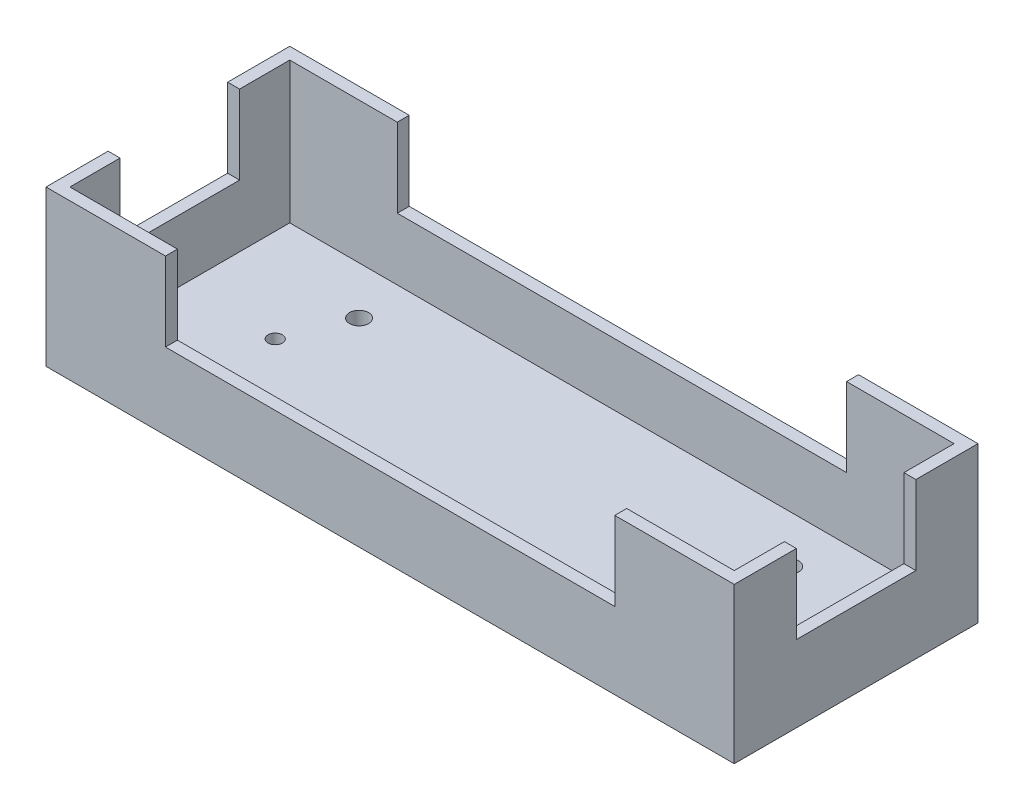
ISO-10303-21;
HEADER;
FILE_DESCRIPTION(('STEP AP214'),'2;1');
FILE_NAME('part.step','',(''),(''),'','','');
FILE_SCHEMA(('AUTOMOTIVE_DESIGN { 1 0 10303 214 1 1 1 1 }'));
ENDSEC;
DATA;
#1=APPLICATION_CONTEXT('core data for automotive mechanical design processes');
#2=APPLICATION_PROTOCOL_DEFINITION('international standard','automotive_design',2000,#1);
#3=PRODUCT_CONTEXT('',#1,'mechanical');
#4=PRODUCT('Part','Part','',(#3));
#5=PRODUCT_RELATED_PRODUCT_CATEGORY('part','',(#4));
#6=PRODUCT_DEFINITION_FORMATION('','',#4);
#7=PRODUCT_DEFINITION_CONTEXT('part definition',#1,'design');
#8=PRODUCT_DEFINITION('design','',#6,#7);
#9=PRODUCT_DEFINITION_SHAPE('','',#8);
#10=(LENGTH_UNIT() NAMED_UNIT(*) SI_UNIT(.MILLI.,.METRE.));
#11=(NAMED_UNIT(*) PLANE_ANGLE_UNIT() SI_UNIT($,.RADIAN.));
#12=(NAMED_UNIT(*) SI_UNIT($,.STERADIAN.) SOLID_ANGLE_UNIT());
#13=UNCERTAINTY_MEASURE_WITH_UNIT(LENGTH_MEASURE(1.E-05),#10,'distance_accuracy_value','');
#14=(GEOMETRIC_REPRESENTATION_CONTEXT(3) GLOBAL_UNCERTAINTY_ASSIGNED_CONTEXT((#13)) GLOBAL_UNIT_ASSIGNED_CONTEXT((#10,
#11,#12)) REPRESENTATION_CONTEXT('',''));
#15=CARTESIAN_POINT('',(0.,0.,0.));
#16=DIRECTION('',(0.,0.,1.));
#17=DIRECTION('',(1.,0.,0.));
#18=AXIS2_PLACEMENT_3D('',#15,#16,#17);
#19=CARTESIAN_POINT('',(0.,16.,0.));
#20=DIRECTION('',(0.,-1.,0.));
#21=DIRECTION('',(0.,0.,-1.));
#22=AXIS2_PLACEMENT_3D('',#19,#20,#21);
#23=PLANE('',#22);
#24=DIRECTION('',(0.,0.,-1.));
#25=VECTOR('',#24,1.);
#26=CARTESIAN_POINT('',(-47.,16.,23.));
#27=LINE('',#26,#25);
#28=CARTESIAN_POINT('',(-47.,16.,25.5));
#29=VERTEX_POINT('',#28);
#30=CARTESIAN_POINT('',(-47.,16.,23.));
#31=VERTEX_POINT('',#30);
#32=EDGE_CURVE('E58',#29,#31,#27,.T.);
#33=ORIENTED_EDGE('',*,*,#32,.F.);
#34=DIRECTION('',(-1.,0.,0.));
#35=VECTOR('',#34,1.);
#36=CARTESIAN_POINT('',(0.,16.,25.5));
#37=LINE('',#36,#35);
#38=CARTESIAN_POINT('',(47.,16.,25.5));
#39=VERTEX_POINT('',#38);
#40=EDGE_CURVE('E391',#39,#29,#37,.T.);
#41=ORIENTED_EDGE('',*,*,#40,.F.);
#42=DIRECTION('',(0.,0.,1.));
#43=VECTOR('',#42,1.);
#44=CARTESIAN_POINT('',(47.,16.,23.));
#45=LINE('',#44,#43);
#46=CARTESIAN_POINT('',(47.,16.,23.));
#47=VERTEX_POINT('',#46);
#48=EDGE_CURVE('E227',#47,#39,#45,.T.);
#49=ORIENTED_EDGE('',*,*,#48,.F.);
#50=DIRECTION('',(-1.,0.,0.));
#51=VECTOR('',#50,1.);
#52=CARTESIAN_POINT('',(0.,16.,23.));
#53=LINE('',#52,#51);
#54=EDGE_CURVE('E332',#47,#31,#53,.T.);
#55=ORIENTED_EDGE('',*,*,#54,.T.);
#56=EDGE_LOOP('',(#33,#41,#49,#55));
#57=FACE_BOUND('',#56,.T.);
#58=ADVANCED_FACE('F33',(#57),#23,.F.);
#59=DIRECTION('',(-1.,0.,0.));
#60=VECTOR('',#59,1.);
#61=CARTESIAN_POINT('',(-72.,16.,12.5));
#62=LINE('',#61,#60);
#63=CARTESIAN_POINT('',(-69.5,16.,12.5));
#64=VERTEX_POINT('',#63);
#65=CARTESIAN_POINT('',(-72.,16.,12.5));
#66=VERTEX_POINT('',#65);
#67=EDGE_CURVE('E220',#64,#66,#62,.T.);
#68=ORIENTED_EDGE('',*,*,#67,.F.);
#69=DIRECTION('',(0.,0.,-1.));
#70=VECTOR('',#69,1.);
#71=CARTESIAN_POINT('',(-69.5,16.,0.));
#72=LINE('',#71,#70);
#73=CARTESIAN_POINT('',(-69.5,16.,-12.5));
#74=VERTEX_POINT('',#73);
#75=EDGE_CURVE('E345',#64,#74,#72,.T.);
#76=ORIENTED_EDGE('',*,*,#75,.T.);
#77=DIRECTION('',(1.,0.,0.));
#78=VECTOR('',#77,1.);
#79=CARTESIAN_POINT('',(-72.,16.,-12.5));
#80=LINE('',#79,#78);
#81=CARTESIAN_POINT('',(-72.,16.,-12.5));
#82=VERTEX_POINT('',#81);
#83=EDGE_CURVE('E295',#82,#74,#80,.T.);
#84=ORIENTED_EDGE('',*,*,#83,.F.);
#85=DIRECTION('',(0.,0.,-1.));
#86=VECTOR('',#85,1.);
#87=CARTESIAN_POINT('',(-72.,16.,0.));
#88=LINE('',#87,#86);
#89=EDGE_CURVE('E50',#66,#82,#88,.T.);
#90=ORIENTED_EDGE('',*,*,#89,.F.);
#91=EDGE_LOOP('',(#68,#76,#84,#90));
#92=FACE_BOUND('',#91,.T.);
#93=ADVANCED_FACE('F453',(#92),#23,.F.);
#94=DIRECTION('',(-1.,0.,0.));
#95=VECTOR('',#94,1.);
#96=CARTESIAN_POINT('',(72.,16.,12.5));
#97=LINE('',#96,#95);
#98=CARTESIAN_POINT('',(72.,16.,12.5));
#99=VERTEX_POINT('',#98);
#100=CARTESIAN_POINT('',(69.5,16.,12.5));
#101=VERTEX_POINT('',#100);
#102=EDGE_CURVE('E223',#99,#101,#97,.T.);
#103=ORIENTED_EDGE('',*,*,#102,.F.);
#104=DIRECTION('',(0.,0.,1.));
#105=VECTOR('',#104,1.);
#106=CARTESIAN_POINT('',(72.,16.,0.));
#107=LINE('',#106,#105);
#108=CARTESIAN_POINT('',(72.,16.,-12.5));
#109=VERTEX_POINT('',#108);
#110=EDGE_CURVE('E386',#109,#99,#107,.T.);
#111=ORIENTED_EDGE('',*,*,#110,.F.);
#112=DIRECTION('',(1.,0.,0.));
#113=VECTOR('',#112,1.);
#114=CARTESIAN_POINT('',(72.,16.,-12.5));
#115=LINE('',#114,#113);
#116=CARTESIAN_POINT('',(69.5,16.,-12.5));
#117=VERTEX_POINT('',#116);
#118=EDGE_CURVE('E267',#117,#109,#115,.T.);
#119=ORIENTED_EDGE('',*,*,#118,.F.);
#120=DIRECTION('',(0.,0.,1.));
#121=VECTOR('',#120,1.);
#122=CARTESIAN_POINT('',(69.5,16.,0.));
#123=LINE('',#122,#121);
#124=EDGE_CURVE('E355',#117,#101,#123,.T.);
#125=ORIENTED_EDGE('',*,*,#124,.T.);
#126=EDGE_LOOP('',(#103,#111,#119,#125));
#127=FACE_BOUND('',#126,.T.);
#128=ADVANCED_FACE('F485',(#127),#23,.F.);
#129=DIRECTION('',(0.,0.,1.));
#130=VECTOR('',#129,1.);
#131=CARTESIAN_POINT('',(47.,16.,-23.));
#132=LINE('',#131,#130);
#133=CARTESIAN_POINT('',(47.,16.,-25.5));
#134=VERTEX_POINT('',#133);
#135=CARTESIAN_POINT('',(47.,16.,-23.));
#136=VERTEX_POINT('',#135);
#137=EDGE_CURVE('E262',#134,#136,#132,.T.);
#138=ORIENTED_EDGE('',*,*,#137,.F.);
#139=DIRECTION('',(1.,0.,0.));
#140=VECTOR('',#139,1.);
#141=CARTESIAN_POINT('',(0.,16.,-25.5));
#142=LINE('',#141,#140);
#143=CARTESIAN_POINT('',(-47.,16.,-25.5));
#144=VERTEX_POINT('',#143);
#145=EDGE_CURVE('E320',#144,#134,#142,.T.);
#146=ORIENTED_EDGE('',*,*,#145,.F.);
#147=DIRECTION('',(0.,0.,-1.));
#148=VECTOR('',#147,1.);
#149=CARTESIAN_POINT('',(-47.,16.,-23.));
#150=LINE('',#149,#148);
#151=CARTESIAN_POINT('',(-47.,16.,-23.));
#152=VERTEX_POINT('',#151);
#153=EDGE_CURVE('E300',#152,#144,#150,.T.);
#154=ORIENTED_EDGE('',*,*,#153,.F.);
#155=DIRECTION('',(1.,0.,0.));
#156=VECTOR('',#155,1.);
#157=CARTESIAN_POINT('',(0.,16.,-23.));
#158=LINE('',#157,#156);
#159=EDGE_CURVE('E348',#152,#136,#158,.T.);
#160=ORIENTED_EDGE('',*,*,#159,.T.);
#161=EDGE_LOOP('',(#138,#146,#154,#160));
#162=FACE_BOUND('',#161,.T.);
#163=ADVANCED_FACE('F487',(#162),#23,.F.);
#164=CARTESIAN_POINT('',(-72.,3.,-25.5));
#165=DIRECTION('',(1.,0.,0.));
#166=DIRECTION('',(0.,0.,-1.));
#167=AXIS2_PLACEMENT_3D('',#164,#165,#166);
#168=PLANE('',#167);
#169=DIRECTION('',(0.,0.,1.));
#170=VECTOR('',#169,1.);
#171=CARTESIAN_POINT('',(-72.,0.,-25.5));
#172=LINE('',#171,#170);
#173=CARTESIAN_POINT('',(-72.,0.,-25.5));
#174=VERTEX_POINT('',#173);
#175=CARTESIAN_POINT('',(-72.,0.,25.5));
#176=VERTEX_POINT('',#175);
#177=EDGE_CURVE('E372',#174,#176,#172,.T.);
#178=ORIENTED_EDGE('',*,*,#177,.T.);
#179=DIRECTION('',(0.,-1.,0.));
#180=VECTOR('',#179,1.);
#181=CARTESIAN_POINT('',(-72.,3.,25.5));
#182=LINE('',#181,#180);
#183=CARTESIAN_POINT('',(-72.,32.5,25.5));
#184=VERTEX_POINT('',#183);
#185=EDGE_CURVE('E11',#184,#176,#182,.T.);
#186=ORIENTED_EDGE('',*,*,#185,.F.);
#187=DIRECTION('',(0.,0.,1.));
#188=VECTOR('',#187,1.);
#189=CARTESIAN_POINT('',(-72.,32.5,25.5));
#190=LINE('',#189,#188);
#191=CARTESIAN_POINT('',(-72.,32.5,12.5));
#192=VERTEX_POINT('',#191);
#193=EDGE_CURVE('E437',#192,#184,#190,.T.);
#194=ORIENTED_EDGE('',*,*,#193,.F.);
#195=DIRECTION('',(0.,-1.,0.));
#196=VECTOR('',#195,1.);
#197=CARTESIAN_POINT('',(-72.,32.5,12.5));
#198=LINE('',#197,#196);
#199=EDGE_CURVE('E230',#192,#66,#198,.T.);
#200=ORIENTED_EDGE('',*,*,#199,.T.);
#201=ORIENTED_EDGE('',*,*,#89,.T.);
#202=DIRECTION('',(0.,-1.,0.));
#203=VECTOR('',#202,1.);
#204=CARTESIAN_POINT('',(-72.,32.5,-12.5));
#205=LINE('',#204,#203);
#206=CARTESIAN_POINT('',(-72.,32.5,-12.5));
#207=VERTEX_POINT('',#206);
#208=EDGE_CURVE('E326',#207,#82,#205,.T.);
#209=ORIENTED_EDGE('',*,*,#208,.F.);
#210=DIRECTION('',(0.,0.,1.));
#211=VECTOR('',#210,1.);
#212=CARTESIAN_POINT('',(-72.,32.5,-25.5));
#213=LINE('',#212,#211);
#214=CARTESIAN_POINT('',(-72.,32.5,-25.5));
#215=VERTEX_POINT('',#214);
#216=EDGE_CURVE('E299',#215,#207,#213,.T.);
#217=ORIENTED_EDGE('',*,*,#216,.F.);
#218=DIRECTION('',(0.,-1.,0.));
#219=VECTOR('',#218,1.);
#220=CARTESIAN_POINT('',(-72.,3.,-25.5));
#221=LINE('',#220,#219);
#222=EDGE_CURVE('E363',#215,#174,#221,.T.);
#223=ORIENTED_EDGE('',*,*,#222,.T.);
#224=EDGE_LOOP('',(#178,#186,#194,#200,#201,#209,#217,#223));
#225=FACE_BOUND('',#224,.T.);
#226=ADVANCED_FACE('F35',(#225),#168,.F.);
#227=CARTESIAN_POINT('',(72.,3.,25.5));
#228=DIRECTION('',(0.,0.,-1.));
#229=DIRECTION('',(-1.,0.,0.));
#230=AXIS2_PLACEMENT_3D('',#227,#228,#229);
#231=PLANE('',#230);
#232=DIRECTION('',(1.,0.,0.));
#233=VECTOR('',#232,1.);
#234=CARTESIAN_POINT('',(72.,0.,25.5));
#235=LINE('',#234,#233);
#236=CARTESIAN_POINT('',(72.,0.,25.5));
#237=VERTEX_POINT('',#236);
#238=EDGE_CURVE('E370',#176,#237,#235,.T.);
#239=ORIENTED_EDGE('',*,*,#238,.T.);
#240=DIRECTION('',(0.,-1.,0.));
#241=VECTOR('',#240,1.);
#242=CARTESIAN_POINT('',(72.,3.,25.5));
#243=LINE('',#242,#241);
#244=CARTESIAN_POINT('',(72.,32.5,25.5));
#245=VERTEX_POINT('',#244);
#246=EDGE_CURVE('E42',#245,#237,#243,.T.);
#247=ORIENTED_EDGE('',*,*,#246,.F.);
#248=DIRECTION('',(1.,0.,0.));
#249=VECTOR('',#248,1.);
#250=CARTESIAN_POINT('',(47.,32.5,25.5));
#251=LINE('',#250,#249);
#252=CARTESIAN_POINT('',(47.,32.5,25.5));
#253=VERTEX_POINT('',#252);
#254=EDGE_CURVE('E234',#253,#245,#251,.T.);
#255=ORIENTED_EDGE('',*,*,#254,.F.);
#256=DIRECTION('',(0.,-1.,0.));
#257=VECTOR('',#256,1.);
#258=CARTESIAN_POINT('',(47.,32.5,25.5));
#259=LINE('',#258,#257);
#260=EDGE_CURVE('E247',#253,#39,#259,.T.);
#261=ORIENTED_EDGE('',*,*,#260,.T.);
#262=ORIENTED_EDGE('',*,*,#40,.T.);
#263=DIRECTION('',(0.,-1.,0.));
#264=VECTOR('',#263,1.);
#265=CARTESIAN_POINT('',(-47.,32.5,25.5));
#266=LINE('',#265,#264);
#267=CARTESIAN_POINT('',(-47.,32.5,25.5));
#268=VERTEX_POINT('',#267);
#269=EDGE_CURVE('E442',#268,#29,#266,.T.);
#270=ORIENTED_EDGE('',*,*,#269,.F.);
#271=DIRECTION('',(1.,0.,0.));
#272=VECTOR('',#271,1.);
#273=CARTESIAN_POINT('',(-47.,32.5,25.5));
#274=LINE('',#273,#272);
#275=EDGE_CURVE('E216',#184,#268,#274,.T.);
#276=ORIENTED_EDGE('',*,*,#275,.F.);
#277=ORIENTED_EDGE('',*,*,#185,.T.);
#278=EDGE_LOOP('',(#239,#247,#255,#261,#262,#270,#276,#277));
#279=FACE_BOUND('',#278,.T.);
#280=ADVANCED_FACE('F477',(#279),#231,.F.);
#281=CARTESIAN_POINT('',(72.,3.,-25.5));
#282=DIRECTION('',(-1.,0.,0.));
#283=DIRECTION('',(0.,0.,1.));
#284=AXIS2_PLACEMENT_3D('',#281,#282,#283);
#285=PLANE('',#284);
#286=DIRECTION('',(0.,0.,-1.));
#287=VECTOR('',#286,1.);
#288=CARTESIAN_POINT('',(72.,0.,-25.5));
#289=LINE('',#288,#287);
#290=CARTESIAN_POINT('',(72.,0.,-25.5));
#291=VERTEX_POINT('',#290);
#292=EDGE_CURVE('E368',#237,#291,#289,.T.);
#293=ORIENTED_EDGE('',*,*,#292,.T.);
#294=DIRECTION('',(0.,-1.,0.));
#295=VECTOR('',#294,1.);
#296=CARTESIAN_POINT('',(72.,3.,-25.5));
#297=LINE('',#296,#295);
#298=CARTESIAN_POINT('',(72.,32.5,-25.5));
#299=VERTEX_POINT('',#298);
#300=EDGE_CURVE('E360',#299,#291,#297,.T.);
#301=ORIENTED_EDGE('',*,*,#300,.F.);
#302=DIRECTION('',(0.,0.,-1.));
#303=VECTOR('',#302,1.);
#304=CARTESIAN_POINT('',(72.,32.5,-25.5));
#305=LINE('',#304,#303);
#306=CARTESIAN_POINT('',(72.,32.5,-12.5));
#307=VERTEX_POINT('',#306);
#308=EDGE_CURVE('E274',#307,#299,#305,.T.);
#309=ORIENTED_EDGE('',*,*,#308,.F.);
#310=DIRECTION('',(0.,-1.,0.));
#311=VECTOR('',#310,1.);
#312=CARTESIAN_POINT('',(72.,32.5,-12.5));
#313=LINE('',#312,#311);
#314=EDGE_CURVE('E286',#307,#109,#313,.T.);
#315=ORIENTED_EDGE('',*,*,#314,.T.);
#316=ORIENTED_EDGE('',*,*,#110,.T.);
#317=DIRECTION('',(0.,-1.,0.));
#318=VECTOR('',#317,1.);
#319=CARTESIAN_POINT('',(72.,32.5,12.5));
#320=LINE('',#319,#318);
#321=CARTESIAN_POINT('',(72.,32.5,12.5));
#322=VERTEX_POINT('',#321);
#323=EDGE_CURVE('E259',#322,#99,#320,.T.);
#324=ORIENTED_EDGE('',*,*,#323,.F.);
#325=DIRECTION('',(0.,0.,-1.));
#326=VECTOR('',#325,1.);
#327=CARTESIAN_POINT('',(72.,32.5,25.5));
#328=LINE('',#327,#326);
#329=EDGE_CURVE('E237',#245,#322,#328,.T.);
#330=ORIENTED_EDGE('',*,*,#329,.F.);
#331=ORIENTED_EDGE('',*,*,#246,.T.);
#332=EDGE_LOOP('',(#293,#301,#309,#315,#316,#324,#330,#331));
#333=FACE_BOUND('',#332,.T.);
#334=ADVANCED_FACE('F484',(#333),#285,.F.);
#335=CARTESIAN_POINT('',(72.,3.,-25.5));
#336=DIRECTION('',(0.,0.,1.));
#337=DIRECTION('',(1.,0.,0.));
#338=AXIS2_PLACEMENT_3D('',#335,#336,#337);
#339=PLANE('',#338);
#340=DIRECTION('',(-1.,0.,0.));
#341=VECTOR('',#340,1.);
#342=CARTESIAN_POINT('',(72.,0.,-25.5));
#343=LINE('',#342,#341);
#344=EDGE_CURVE('E366',#291,#174,#343,.T.);
#345=ORIENTED_EDGE('',*,*,#344,.T.);
#346=ORIENTED_EDGE('',*,*,#222,.F.);
#347=DIRECTION('',(-1.,0.,0.));
#348=VECTOR('',#347,1.);
#349=CARTESIAN_POINT('',(-47.,32.5,-25.5));
#350=LINE('',#349,#348);
#351=CARTESIAN_POINT('',(-47.,32.5,-25.5));
#352=VERTEX_POINT('',#351);
#353=EDGE_CURVE('E296',#352,#215,#350,.T.);
#354=ORIENTED_EDGE('',*,*,#353,.F.);
#355=DIRECTION('',(0.,-1.,0.));
#356=VECTOR('',#355,1.);
#357=CARTESIAN_POINT('',(-47.,32.5,-25.5));
#358=LINE('',#357,#356);
#359=EDGE_CURVE('E311',#352,#144,#358,.T.);
#360=ORIENTED_EDGE('',*,*,#359,.T.);
#361=ORIENTED_EDGE('',*,*,#145,.T.);
#362=DIRECTION('',(0.,-1.,0.));
#363=VECTOR('',#362,1.);
#364=CARTESIAN_POINT('',(47.,32.5,-25.5));
#365=LINE('',#364,#363);
#366=CARTESIAN_POINT('',(47.,32.5,-25.5));
#367=VERTEX_POINT('',#366);
#368=EDGE_CURVE('E279',#367,#134,#365,.T.);
#369=ORIENTED_EDGE('',*,*,#368,.F.);
#370=DIRECTION('',(-1.,0.,0.));
#371=VECTOR('',#370,1.);
#372=CARTESIAN_POINT('',(47.,32.5,-25.5));
#373=LINE('',#372,#371);
#374=EDGE_CURVE('E277',#299,#367,#373,.T.);
#375=ORIENTED_EDGE('',*,*,#374,.F.);
#376=ORIENTED_EDGE('',*,*,#300,.T.);
#377=EDGE_LOOP('',(#345,#346,#354,#360,#361,#369,#375,#376));
#378=FACE_BOUND('',#377,.T.);
#379=ADVANCED_FACE('F469',(#378),#339,.F.);
#380=CARTESIAN_POINT('',(0.,0.,0.));
#381=DIRECTION('',(0.,-1.,0.));
#382=DIRECTION('',(0.,0.,-1.));
#383=AXIS2_PLACEMENT_3D('',#380,#381,#382);
#384=PLANE('',#383);
#385=CARTESIAN_POINT('',(50.,0.,-0.450000000000011));
#386=DIRECTION('',(0.,-1.,0.));
#387=DIRECTION('',(0.,0.,1.));
#388=AXIS2_PLACEMENT_3D('',#385,#386,#387);
#389=CIRCLE('',#388,1.5);
#390=CARTESIAN_POINT('',(50.,0.,1.04999999999999));
#391=VERTEX_POINT('',#390);
#392=EDGE_CURVE('E767',#391,#391,#389,.T.);
#393=ORIENTED_EDGE('',*,*,#392,.F.);
#394=EDGE_LOOP('',(#393));
#395=FACE_BOUND('',#394,.T.);
#396=CARTESIAN_POINT('',(-50.,0.,-0.450000000000011));
#397=DIRECTION('',(0.,-1.,0.));
#398=DIRECTION('',(0.,0.,-1.));
#399=AXIS2_PLACEMENT_3D('',#396,#397,#398);
#400=CIRCLE('',#399,1.5);
#401=CARTESIAN_POINT('',(-50.,0.,-1.95000000000002));
#402=VERTEX_POINT('',#401);
#403=EDGE_CURVE('E770',#402,#402,#400,.T.);
#404=ORIENTED_EDGE('',*,*,#403,.F.);
#405=EDGE_LOOP('',(#404));
#406=FACE_BOUND('',#405,.T.);
#407=CARTESIAN_POINT('',(45.,0.,-13.));
#408=DIRECTION('',(0.,-1.,0.));
#409=DIRECTION('',(0.,0.,1.));
#410=AXIS2_PLACEMENT_3D('',#407,#408,#409);
#411=CIRCLE('',#410,2.);
#412=CARTESIAN_POINT('',(45.,0.,-11.));
#413=VERTEX_POINT('',#412);
#414=EDGE_CURVE('E776',#413,#413,#411,.T.);
#415=ORIENTED_EDGE('',*,*,#414,.F.);
#416=EDGE_LOOP('',(#415));
#417=FACE_BOUND('',#416,.T.);
#418=CARTESIAN_POINT('',(45.,0.,13.));
#419=DIRECTION('',(0.,-1.,0.));
#420=DIRECTION('',(0.,0.,1.));
#421=AXIS2_PLACEMENT_3D('',#418,#419,#420);
#422=CIRCLE('',#421,2.);
#423=CARTESIAN_POINT('',(45.,0.,15.));
#424=VERTEX_POINT('',#423);
#425=EDGE_CURVE('E780',#424,#424,#422,.T.);
#426=ORIENTED_EDGE('',*,*,#425,.F.);
#427=EDGE_LOOP('',(#426));
#428=FACE_BOUND('',#427,.T.);
#429=CARTESIAN_POINT('',(-45.,0.,13.));
#430=DIRECTION('',(0.,-1.,0.));
#431=DIRECTION('',(0.,0.,-1.));
#432=AXIS2_PLACEMENT_3D('',#429,#430,#431);
#433=CIRCLE('',#432,2.);
#434=CARTESIAN_POINT('',(-45.,0.,11.));
#435=VERTEX_POINT('',#434);
#436=EDGE_CURVE('E784',#435,#435,#433,.T.);
#437=ORIENTED_EDGE('',*,*,#436,.F.);
#438=EDGE_LOOP('',(#437));
#439=FACE_BOUND('',#438,.T.);
#440=CARTESIAN_POINT('',(-45.,0.,-13.));
#441=DIRECTION('',(0.,-1.,0.));
#442=DIRECTION('',(0.,0.,-1.));
#443=AXIS2_PLACEMENT_3D('',#440,#441,#442);
#444=CIRCLE('',#443,2.);
#445=CARTESIAN_POINT('',(-45.,0.,-15.));
#446=VERTEX_POINT('',#445);
#447=EDGE_CURVE('E788',#446,#446,#444,.T.);
#448=ORIENTED_EDGE('',*,*,#447,.F.);
#449=EDGE_LOOP('',(#448));
#450=FACE_BOUND('',#449,.T.);
#451=ORIENTED_EDGE('',*,*,#177,.F.);
#452=ORIENTED_EDGE('',*,*,#344,.F.);
#453=ORIENTED_EDGE('',*,*,#292,.F.);
#454=ORIENTED_EDGE('',*,*,#238,.F.);
#455=EDGE_LOOP('',(#451,#452,#453,#454));
#456=FACE_BOUND('',#455,.T.);
#457=ADVANCED_FACE('F474',(#395,#406,#417,#428,#439,#450,#456),#384,.T.);
#458=CARTESIAN_POINT('',(0.,16.,23.));
#459=DIRECTION('',(0.,0.,1.));
#460=DIRECTION('',(1.,0.,0.));
#461=AXIS2_PLACEMENT_3D('',#458,#459,#460);
#462=PLANE('',#461);
#463=DIRECTION('',(0.,-1.,0.));
#464=VECTOR('',#463,1.);
#465=CARTESIAN_POINT('',(69.5,16.,23.));
#466=LINE('',#465,#464);
#467=CARTESIAN_POINT('',(69.5,32.5,23.));
#468=VERTEX_POINT('',#467);
#469=CARTESIAN_POINT('',(69.5,3.,23.));
#470=VERTEX_POINT('',#469);
#471=EDGE_CURVE('E393',#468,#470,#466,.T.);
#472=ORIENTED_EDGE('',*,*,#471,.T.);
#473=DIRECTION('',(-1.,0.,0.));
#474=VECTOR('',#473,1.);
#475=CARTESIAN_POINT('',(0.,3.,23.));
#476=LINE('',#475,#474);
#477=CARTESIAN_POINT('',(-69.5,3.,23.));
#478=VERTEX_POINT('',#477);
#479=EDGE_CURVE('E375',#470,#478,#476,.T.);
#480=ORIENTED_EDGE('',*,*,#479,.T.);
#481=DIRECTION('',(0.,-1.,0.));
#482=VECTOR('',#481,1.);
#483=CARTESIAN_POINT('',(-69.5,16.,23.));
#484=LINE('',#483,#482);
#485=CARTESIAN_POINT('',(-69.5,32.5,23.));
#486=VERTEX_POINT('',#485);
#487=EDGE_CURVE('E206',#486,#478,#484,.T.);
#488=ORIENTED_EDGE('',*,*,#487,.F.);
#489=DIRECTION('',(-1.,0.,0.));
#490=VECTOR('',#489,1.);
#491=CARTESIAN_POINT('',(-69.5,32.5,23.));
#492=LINE('',#491,#490);
#493=CARTESIAN_POINT('',(-47.,32.5,23.));
#494=VERTEX_POINT('',#493);
#495=EDGE_CURVE('E197',#494,#486,#492,.T.);
#496=ORIENTED_EDGE('',*,*,#495,.F.);
#497=DIRECTION('',(0.,-1.,0.));
#498=VECTOR('',#497,1.);
#499=CARTESIAN_POINT('',(-47.,32.5,23.));
#500=LINE('',#499,#498);
#501=EDGE_CURVE('E203',#494,#31,#500,.T.);
#502=ORIENTED_EDGE('',*,*,#501,.T.);
#503=ORIENTED_EDGE('',*,*,#54,.F.);
#504=DIRECTION('',(0.,-1.,0.));
#505=VECTOR('',#504,1.);
#506=CARTESIAN_POINT('',(47.,32.5,23.));
#507=LINE('',#506,#505);
#508=CARTESIAN_POINT('',(47.,32.5,23.));
#509=VERTEX_POINT('',#508);
#510=EDGE_CURVE('E253',#509,#47,#507,.T.);
#511=ORIENTED_EDGE('',*,*,#510,.F.);
#512=DIRECTION('',(-1.,0.,0.));
#513=VECTOR('',#512,1.);
#514=CARTESIAN_POINT('',(69.5,32.5,23.));
#515=LINE('',#514,#513);
#516=EDGE_CURVE('E244',#468,#509,#515,.T.);
#517=ORIENTED_EDGE('',*,*,#516,.F.);
#518=EDGE_LOOP('',(#472,#480,#488,#496,#502,#503,#511,#517));
#519=FACE_BOUND('',#518,.T.);
#520=ADVANCED_FACE('F200',(#519),#462,.F.);
#521=CARTESIAN_POINT('',(69.5,16.,0.));
#522=DIRECTION('',(1.,0.,0.));
#523=DIRECTION('',(0.,0.,-1.));
#524=AXIS2_PLACEMENT_3D('',#521,#522,#523);
#525=PLANE('',#524);
#526=DIRECTION('',(0.,-1.,0.));
#527=VECTOR('',#526,1.);
#528=CARTESIAN_POINT('',(69.5,16.,-23.));
#529=LINE('',#528,#527);
#530=CARTESIAN_POINT('',(69.5,32.5,-23.));
#531=VERTEX_POINT('',#530);
#532=CARTESIAN_POINT('',(69.5,3.,-23.));
#533=VERTEX_POINT('',#532);
#534=EDGE_CURVE('E398',#531,#533,#529,.T.);
#535=ORIENTED_EDGE('',*,*,#534,.T.);
#536=DIRECTION('',(0.,0.,1.));
#537=VECTOR('',#536,1.);
#538=CARTESIAN_POINT('',(69.5,3.,0.));
#539=LINE('',#538,#537);
#540=EDGE_CURVE('E377',#533,#470,#539,.T.);
#541=ORIENTED_EDGE('',*,*,#540,.T.);
#542=ORIENTED_EDGE('',*,*,#471,.F.);
#543=DIRECTION('',(0.,0.,1.));
#544=VECTOR('',#543,1.);
#545=CARTESIAN_POINT('',(69.5,32.5,12.5));
#546=LINE('',#545,#544);
#547=CARTESIAN_POINT('',(69.5,32.5,12.5));
#548=VERTEX_POINT('',#547);
#549=EDGE_CURVE('E241',#548,#468,#546,.T.);
#550=ORIENTED_EDGE('',*,*,#549,.F.);
#551=DIRECTION('',(0.,-1.,0.));
#552=VECTOR('',#551,1.);
#553=CARTESIAN_POINT('',(69.5,32.5,12.5));
#554=LINE('',#553,#552);
#555=EDGE_CURVE('E256',#548,#101,#554,.T.);
#556=ORIENTED_EDGE('',*,*,#555,.T.);
#557=ORIENTED_EDGE('',*,*,#124,.F.);
#558=DIRECTION('',(0.,-1.,0.));
#559=VECTOR('',#558,1.);
#560=CARTESIAN_POINT('',(69.5,32.5,-12.5));
#561=LINE('',#560,#559);
#562=CARTESIAN_POINT('',(69.5,32.5,-12.5));
#563=VERTEX_POINT('',#562);
#564=EDGE_CURVE('E289',#563,#117,#561,.T.);
#565=ORIENTED_EDGE('',*,*,#564,.F.);
#566=DIRECTION('',(0.,0.,1.));
#567=VECTOR('',#566,1.);
#568=CARTESIAN_POINT('',(69.5,32.5,-12.5));
#569=LINE('',#568,#567);
#570=EDGE_CURVE('E270',#531,#563,#569,.T.);
#571=ORIENTED_EDGE('',*,*,#570,.F.);
#572=EDGE_LOOP('',(#535,#541,#542,#550,#556,#557,#565,#571));
#573=FACE_BOUND('',#572,.T.);
#574=ADVANCED_FACE('F404',(#573),#525,.F.);
#575=CARTESIAN_POINT('',(0.,16.,-23.));
#576=DIRECTION('',(0.,0.,-1.));
#577=DIRECTION('',(-1.,0.,0.));
#578=AXIS2_PLACEMENT_3D('',#575,#576,#577);
#579=PLANE('',#578);
#580=DIRECTION('',(0.,-1.,0.));
#581=VECTOR('',#580,1.);
#582=CARTESIAN_POINT('',(-69.5,16.,-23.));
#583=LINE('',#582,#581);
#584=CARTESIAN_POINT('',(-69.5,32.5,-23.));
#585=VERTEX_POINT('',#584);
#586=CARTESIAN_POINT('',(-69.5,3.,-23.));
#587=VERTEX_POINT('',#586);
#588=EDGE_CURVE('E395',#585,#587,#583,.T.);
#589=ORIENTED_EDGE('',*,*,#588,.T.);
#590=DIRECTION('',(1.,0.,0.));
#591=VECTOR('',#590,1.);
#592=CARTESIAN_POINT('',(0.,3.,-23.));
#593=LINE('',#592,#591);
#594=EDGE_CURVE('E380',#587,#533,#593,.T.);
#595=ORIENTED_EDGE('',*,*,#594,.T.);
#596=ORIENTED_EDGE('',*,*,#534,.F.);
#597=DIRECTION('',(1.,0.,0.));
#598=VECTOR('',#597,1.);
#599=CARTESIAN_POINT('',(69.5,32.5,-23.));
#600=LINE('',#599,#598);
#601=CARTESIAN_POINT('',(47.,32.5,-23.));
#602=VERTEX_POINT('',#601);
#603=EDGE_CURVE('E266',#602,#531,#600,.T.);
#604=ORIENTED_EDGE('',*,*,#603,.F.);
#605=DIRECTION('',(0.,-1.,0.));
#606=VECTOR('',#605,1.);
#607=CARTESIAN_POINT('',(47.,32.5,-23.));
#608=LINE('',#607,#606);
#609=EDGE_CURVE('E292',#602,#136,#608,.T.);
#610=ORIENTED_EDGE('',*,*,#609,.T.);
#611=ORIENTED_EDGE('',*,*,#159,.F.);
#612=DIRECTION('',(0.,-1.,0.));
#613=VECTOR('',#612,1.);
#614=CARTESIAN_POINT('',(-47.,32.5,-23.));
#615=LINE('',#614,#613);
#616=CARTESIAN_POINT('',(-47.,32.5,-23.));
#617=VERTEX_POINT('',#616);
#618=EDGE_CURVE('E327',#617,#152,#615,.T.);
#619=ORIENTED_EDGE('',*,*,#618,.F.);
#620=DIRECTION('',(1.,0.,0.));
#621=VECTOR('',#620,1.);
#622=CARTESIAN_POINT('',(-69.5,32.5,-23.));
#623=LINE('',#622,#621);
#624=EDGE_CURVE('E307',#585,#617,#623,.T.);
#625=ORIENTED_EDGE('',*,*,#624,.F.);
#626=EDGE_LOOP('',(#589,#595,#596,#604,#610,#611,#619,#625));
#627=FACE_BOUND('',#626,.T.);
#628=ADVANCED_FACE('F426',(#627),#579,.F.);
#629=CARTESIAN_POINT('',(-69.5,16.,0.));
#630=DIRECTION('',(-1.,0.,0.));
#631=DIRECTION('',(0.,0.,1.));
#632=AXIS2_PLACEMENT_3D('',#629,#630,#631);
#633=PLANE('',#632);
#634=ORIENTED_EDGE('',*,*,#487,.T.);
#635=DIRECTION('',(0.,0.,-1.));
#636=VECTOR('',#635,1.);
#637=CARTESIAN_POINT('',(-69.5,3.,0.));
#638=LINE('',#637,#636);
#639=EDGE_CURVE('E383',#478,#587,#638,.T.);
#640=ORIENTED_EDGE('',*,*,#639,.T.);
#641=ORIENTED_EDGE('',*,*,#588,.F.);
#642=DIRECTION('',(0.,0.,-1.));
#643=VECTOR('',#642,1.);
#644=CARTESIAN_POINT('',(-69.5,32.5,-12.5));
#645=LINE('',#644,#643);
#646=CARTESIAN_POINT('',(-69.5,32.5,-12.5));
#647=VERTEX_POINT('',#646);
#648=EDGE_CURVE('E304',#647,#585,#645,.T.);
#649=ORIENTED_EDGE('',*,*,#648,.F.);
#650=DIRECTION('',(0.,-1.,0.));
#651=VECTOR('',#650,1.);
#652=CARTESIAN_POINT('',(-69.5,32.5,-12.5));
#653=LINE('',#652,#651);
#654=EDGE_CURVE('E323',#647,#74,#653,.T.);
#655=ORIENTED_EDGE('',*,*,#654,.T.);
#656=ORIENTED_EDGE('',*,*,#75,.F.);
#657=DIRECTION('',(0.,-1.,0.));
#658=VECTOR('',#657,1.);
#659=CARTESIAN_POINT('',(-69.5,32.5,12.5));
#660=LINE('',#659,#658);
#661=CARTESIAN_POINT('',(-69.5,32.5,12.5));
#662=VERTEX_POINT('',#661);
#663=EDGE_CURVE('E224',#662,#64,#660,.T.);
#664=ORIENTED_EDGE('',*,*,#663,.F.);
#665=DIRECTION('',(0.,0.,-1.));
#666=VECTOR('',#665,1.);
#667=CARTESIAN_POINT('',(-69.5,32.5,12.5));
#668=LINE('',#667,#666);
#669=EDGE_CURVE('E209',#486,#662,#668,.T.);
#670=ORIENTED_EDGE('',*,*,#669,.F.);
#671=EDGE_LOOP('',(#634,#640,#641,#649,#655,#656,#664,#670));
#672=FACE_BOUND('',#671,.T.);
#673=ADVANCED_FACE('F431',(#672),#633,.F.);
#674=CARTESIAN_POINT('',(0.,3.,0.));
#675=DIRECTION('',(0.,-1.,0.));
#676=DIRECTION('',(0.,0.,-1.));
#677=AXIS2_PLACEMENT_3D('',#674,#675,#676);
#678=PLANE('',#677);
#679=CARTESIAN_POINT('',(50.,3.,-0.450000000000011));
#680=DIRECTION('',(0.,-1.,0.));
#681=DIRECTION('',(0.,0.,-1.));
#682=AXIS2_PLACEMENT_3D('',#679,#680,#681);
#683=CIRCLE('',#682,1.5);
#684=CARTESIAN_POINT('',(50.,3.,-1.95000000000002));
#685=VERTEX_POINT('',#684);
#686=EDGE_CURVE('E37',#685,#685,#683,.T.);
#687=ORIENTED_EDGE('',*,*,#686,.T.);
#688=EDGE_LOOP('',(#687));
#689=FACE_BOUND('',#688,.T.);
#690=CARTESIAN_POINT('',(-50.,3.,-0.450000000000011));
#691=DIRECTION('',(0.,-1.,0.));
#692=DIRECTION('',(0.,0.,-1.));
#693=AXIS2_PLACEMENT_3D('',#690,#691,#692);
#694=CIRCLE('',#693,1.5);
#695=CARTESIAN_POINT('',(-50.,3.,-1.95000000000002));
#696=VERTEX_POINT('',#695);
#697=EDGE_CURVE('E772',#696,#696,#694,.T.);
#698=ORIENTED_EDGE('',*,*,#697,.T.);
#699=EDGE_LOOP('',(#698));
#700=FACE_BOUND('',#699,.T.);
#701=CARTESIAN_POINT('',(45.,3.,-13.));
#702=DIRECTION('',(0.,-1.,0.));
#703=DIRECTION('',(0.,0.,-1.));
#704=AXIS2_PLACEMENT_3D('',#701,#702,#703);
#705=CIRCLE('',#704,2.);
#706=CARTESIAN_POINT('',(45.,3.,-15.));
#707=VERTEX_POINT('',#706);
#708=EDGE_CURVE('E779',#707,#707,#705,.T.);
#709=ORIENTED_EDGE('',*,*,#708,.T.);
#710=EDGE_LOOP('',(#709));
#711=FACE_BOUND('',#710,.T.);
#712=CARTESIAN_POINT('',(45.,3.,13.));
#713=DIRECTION('',(0.,-1.,0.));
#714=DIRECTION('',(0.,0.,-1.));
#715=AXIS2_PLACEMENT_3D('',#712,#713,#714);
#716=CIRCLE('',#715,2.);
#717=CARTESIAN_POINT('',(45.,3.,11.));
#718=VERTEX_POINT('',#717);
#719=EDGE_CURVE('E783',#718,#718,#716,.T.);
#720=ORIENTED_EDGE('',*,*,#719,.T.);
#721=EDGE_LOOP('',(#720));
#722=FACE_BOUND('',#721,.T.);
#723=CARTESIAN_POINT('',(-45.,3.,13.));
#724=DIRECTION('',(0.,-1.,0.));
#725=DIRECTION('',(0.,0.,-1.));
#726=AXIS2_PLACEMENT_3D('',#723,#724,#725);
#727=CIRCLE('',#726,2.);
#728=CARTESIAN_POINT('',(-45.,3.,11.));
#729=VERTEX_POINT('',#728);
#730=EDGE_CURVE('E787',#729,#729,#727,.T.);
#731=ORIENTED_EDGE('',*,*,#730,.T.);
#732=EDGE_LOOP('',(#731));
#733=FACE_BOUND('',#732,.T.);
#734=CARTESIAN_POINT('',(-45.,3.,-13.));
#735=DIRECTION('',(0.,-1.,0.));
#736=DIRECTION('',(0.,0.,-1.));
#737=AXIS2_PLACEMENT_3D('',#734,#735,#736);
#738=CIRCLE('',#737,2.);
#739=CARTESIAN_POINT('',(-45.,3.,-15.));
#740=VERTEX_POINT('',#739);
#741=EDGE_CURVE('E444',#740,#740,#738,.T.);
#742=ORIENTED_EDGE('',*,*,#741,.T.);
#743=EDGE_LOOP('',(#742));
#744=FACE_BOUND('',#743,.T.);
#745=ORIENTED_EDGE('',*,*,#479,.F.);
#746=ORIENTED_EDGE('',*,*,#540,.F.);
#747=ORIENTED_EDGE('',*,*,#594,.F.);
#748=ORIENTED_EDGE('',*,*,#639,.F.);
#749=EDGE_LOOP('',(#745,#746,#747,#748));
#750=FACE_BOUND('',#749,.T.);
#751=ADVANCED_FACE('F429',(#689,#700,#711,#722,#733,#744,#750),#678,.F.);
#752=CARTESIAN_POINT('',(-72.,32.5,-12.5));
#753=DIRECTION('',(0.,0.,-1.));
#754=DIRECTION('',(-1.,0.,0.));
#755=AXIS2_PLACEMENT_3D('',#752,#753,#754);
#756=PLANE('',#755);
#757=ORIENTED_EDGE('',*,*,#83,.T.);
#758=ORIENTED_EDGE('',*,*,#654,.F.);
#759=DIRECTION('',(1.,0.,0.));
#760=VECTOR('',#759,1.);
#761=CARTESIAN_POINT('',(-72.,32.5,-12.5));
#762=LINE('',#761,#760);
#763=EDGE_CURVE('E302',#207,#647,#762,.T.);
#764=ORIENTED_EDGE('',*,*,#763,.F.);
#765=ORIENTED_EDGE('',*,*,#208,.T.);
#766=EDGE_LOOP('',(#757,#758,#764,#765));
#767=FACE_BOUND('',#766,.T.);
#768=ADVANCED_FACE('F456',(#767),#756,.F.);
#769=CARTESIAN_POINT('',(-47.,32.5,-23.));
#770=DIRECTION('',(-1.,0.,0.));
#771=DIRECTION('',(0.,0.,1.));
#772=AXIS2_PLACEMENT_3D('',#769,#770,#771);
#773=PLANE('',#772);
#774=ORIENTED_EDGE('',*,*,#153,.T.);
#775=ORIENTED_EDGE('',*,*,#359,.F.);
#776=DIRECTION('',(0.,0.,-1.));
#777=VECTOR('',#776,1.);
#778=CARTESIAN_POINT('',(-47.,32.5,-23.));
#779=LINE('',#778,#777);
#780=EDGE_CURVE('E309',#617,#352,#779,.T.);
#781=ORIENTED_EDGE('',*,*,#780,.F.);
#782=ORIENTED_EDGE('',*,*,#618,.T.);
#783=EDGE_LOOP('',(#774,#775,#781,#782));
#784=FACE_BOUND('',#783,.T.);
#785=ADVANCED_FACE('F465',(#784),#773,.F.);
#786=CARTESIAN_POINT('',(0.,32.5,0.));
#787=DIRECTION('',(0.,1.,0.));
#788=DIRECTION('',(0.,0.,1.));
#789=AXIS2_PLACEMENT_3D('',#786,#787,#788);
#790=PLANE('',#789);
#791=ORIENTED_EDGE('',*,*,#353,.T.);
#792=ORIENTED_EDGE('',*,*,#216,.T.);
#793=ORIENTED_EDGE('',*,*,#763,.T.);
#794=ORIENTED_EDGE('',*,*,#648,.T.);
#795=ORIENTED_EDGE('',*,*,#624,.T.);
#796=ORIENTED_EDGE('',*,*,#780,.T.);
#797=EDGE_LOOP('',(#791,#792,#793,#794,#795,#796));
#798=FACE_BOUND('',#797,.T.);
#799=ADVANCED_FACE('F459',(#798),#790,.T.);
#800=CARTESIAN_POINT('',(47.,32.5,-23.));
#801=DIRECTION('',(1.,0.,0.));
#802=DIRECTION('',(0.,0.,-1.));
#803=AXIS2_PLACEMENT_3D('',#800,#801,#802);
#804=PLANE('',#803);
#805=ORIENTED_EDGE('',*,*,#137,.T.);
#806=ORIENTED_EDGE('',*,*,#609,.F.);
#807=DIRECTION('',(0.,0.,1.));
#808=VECTOR('',#807,1.);
#809=CARTESIAN_POINT('',(47.,32.5,-23.));
#810=LINE('',#809,#808);
#811=EDGE_CURVE('E263',#367,#602,#810,.T.);
#812=ORIENTED_EDGE('',*,*,#811,.F.);
#813=ORIENTED_EDGE('',*,*,#368,.T.);
#814=EDGE_LOOP('',(#805,#806,#812,#813));
#815=FACE_BOUND('',#814,.T.);
#816=ADVANCED_FACE('F610',(#815),#804,.F.);
#817=CARTESIAN_POINT('',(72.,32.5,-12.5));
#818=DIRECTION('',(0.,0.,-1.));
#819=DIRECTION('',(-1.,0.,0.));
#820=AXIS2_PLACEMENT_3D('',#817,#818,#819);
#821=PLANE('',#820);
#822=ORIENTED_EDGE('',*,*,#118,.T.);
#823=ORIENTED_EDGE('',*,*,#314,.F.);
#824=DIRECTION('',(1.,0.,0.));
#825=VECTOR('',#824,1.);
#826=CARTESIAN_POINT('',(72.,32.5,-12.5));
#827=LINE('',#826,#825);
#828=EDGE_CURVE('E272',#563,#307,#827,.T.);
#829=ORIENTED_EDGE('',*,*,#828,.F.);
#830=ORIENTED_EDGE('',*,*,#564,.T.);
#831=EDGE_LOOP('',(#822,#823,#829,#830));
#832=FACE_BOUND('',#831,.T.);
#833=ADVANCED_FACE('F419',(#832),#821,.F.);
#834=CARTESIAN_POINT('',(0.,32.5,0.));
#835=DIRECTION('',(0.,-1.,0.));
#836=DIRECTION('',(0.,0.,-1.));
#837=AXIS2_PLACEMENT_3D('',#834,#835,#836);
#838=PLANE('',#837);
#839=ORIENTED_EDGE('',*,*,#811,.T.);
#840=ORIENTED_EDGE('',*,*,#603,.T.);
#841=ORIENTED_EDGE('',*,*,#570,.T.);
#842=ORIENTED_EDGE('',*,*,#828,.T.);
#843=ORIENTED_EDGE('',*,*,#308,.T.);
#844=ORIENTED_EDGE('',*,*,#374,.T.);
#845=EDGE_LOOP('',(#839,#840,#841,#842,#843,#844));
#846=FACE_BOUND('',#845,.T.);
#847=ADVANCED_FACE('F423',(#846),#838,.F.);
#848=CARTESIAN_POINT('',(72.,32.5,12.5));
#849=DIRECTION('',(0.,0.,1.));
#850=DIRECTION('',(1.,0.,0.));
#851=AXIS2_PLACEMENT_3D('',#848,#849,#850);
#852=PLANE('',#851);
#853=ORIENTED_EDGE('',*,*,#102,.T.);
#854=ORIENTED_EDGE('',*,*,#555,.F.);
#855=DIRECTION('',(-1.,0.,0.));
#856=VECTOR('',#855,1.);
#857=CARTESIAN_POINT('',(72.,32.5,12.5));
#858=LINE('',#857,#856);
#859=EDGE_CURVE('E239',#322,#548,#858,.T.);
#860=ORIENTED_EDGE('',*,*,#859,.F.);
#861=ORIENTED_EDGE('',*,*,#323,.T.);
#862=EDGE_LOOP('',(#853,#854,#860,#861));
#863=FACE_BOUND('',#862,.T.);
#864=ADVANCED_FACE('F412',(#863),#852,.F.);
#865=CARTESIAN_POINT('',(47.,32.5,23.));
#866=DIRECTION('',(1.,0.,0.));
#867=DIRECTION('',(0.,0.,-1.));
#868=AXIS2_PLACEMENT_3D('',#865,#866,#867);
#869=PLANE('',#868);
#870=ORIENTED_EDGE('',*,*,#48,.T.);
#871=ORIENTED_EDGE('',*,*,#260,.F.);
#872=DIRECTION('',(0.,0.,1.));
#873=VECTOR('',#872,1.);
#874=CARTESIAN_POINT('',(47.,32.5,23.));
#875=LINE('',#874,#873);
#876=EDGE_CURVE('E246',#509,#253,#875,.T.);
#877=ORIENTED_EDGE('',*,*,#876,.F.);
#878=ORIENTED_EDGE('',*,*,#510,.T.);
#879=EDGE_LOOP('',(#870,#871,#877,#878));
#880=FACE_BOUND('',#879,.T.);
#881=ADVANCED_FACE('F481',(#880),#869,.F.);
#882=CARTESIAN_POINT('',(0.,32.5,0.));
#883=DIRECTION('',(0.,1.,0.));
#884=DIRECTION('',(0.,0.,1.));
#885=AXIS2_PLACEMENT_3D('',#882,#883,#884);
#886=PLANE('',#885);
#887=ORIENTED_EDGE('',*,*,#254,.T.);
#888=ORIENTED_EDGE('',*,*,#329,.T.);
#889=ORIENTED_EDGE('',*,*,#859,.T.);
#890=ORIENTED_EDGE('',*,*,#549,.T.);
#891=ORIENTED_EDGE('',*,*,#516,.T.);
#892=ORIENTED_EDGE('',*,*,#876,.T.);
#893=EDGE_LOOP('',(#887,#888,#889,#890,#891,#892));
#894=FACE_BOUND('',#893,.T.);
#895=ADVANCED_FACE('F406',(#894),#886,.T.);
#896=CARTESIAN_POINT('',(-47.,32.5,23.));
#897=DIRECTION('',(-1.,0.,0.));
#898=DIRECTION('',(0.,0.,1.));
#899=AXIS2_PLACEMENT_3D('',#896,#897,#898);
#900=PLANE('',#899);
#901=ORIENTED_EDGE('',*,*,#32,.T.);
#902=ORIENTED_EDGE('',*,*,#501,.F.);
#903=DIRECTION('',(0.,0.,-1.));
#904=VECTOR('',#903,1.);
#905=CARTESIAN_POINT('',(-47.,32.5,23.));
#906=LINE('',#905,#904);
#907=EDGE_CURVE('E210',#268,#494,#906,.T.);
#908=ORIENTED_EDGE('',*,*,#907,.F.);
#909=ORIENTED_EDGE('',*,*,#269,.T.);
#910=EDGE_LOOP('',(#901,#902,#908,#909));
#911=FACE_BOUND('',#910,.T.);
#912=ADVANCED_FACE('F222',(#911),#900,.F.);
#913=CARTESIAN_POINT('',(-72.,32.5,12.5));
#914=DIRECTION('',(0.,0.,1.));
#915=DIRECTION('',(1.,0.,0.));
#916=AXIS2_PLACEMENT_3D('',#913,#914,#915);
#917=PLANE('',#916);
#918=ORIENTED_EDGE('',*,*,#67,.T.);
#919=ORIENTED_EDGE('',*,*,#199,.F.);
#920=DIRECTION('',(-1.,0.,0.));
#921=VECTOR('',#920,1.);
#922=CARTESIAN_POINT('',(-72.,32.5,12.5));
#923=LINE('',#922,#921);
#924=EDGE_CURVE('E435',#662,#192,#923,.T.);
#925=ORIENTED_EDGE('',*,*,#924,.F.);
#926=ORIENTED_EDGE('',*,*,#663,.T.);
#927=EDGE_LOOP('',(#918,#919,#925,#926));
#928=FACE_BOUND('',#927,.T.);
#929=ADVANCED_FACE('F452',(#928),#917,.F.);
#930=CARTESIAN_POINT('',(0.,32.5,0.));
#931=DIRECTION('',(0.,-1.,0.));
#932=DIRECTION('',(0.,0.,-1.));
#933=AXIS2_PLACEMENT_3D('',#930,#931,#932);
#934=PLANE('',#933);
#935=ORIENTED_EDGE('',*,*,#907,.T.);
#936=ORIENTED_EDGE('',*,*,#495,.T.);
#937=ORIENTED_EDGE('',*,*,#669,.T.);
#938=ORIENTED_EDGE('',*,*,#924,.T.);
#939=ORIENTED_EDGE('',*,*,#193,.T.);
#940=ORIENTED_EDGE('',*,*,#275,.T.);
#941=EDGE_LOOP('',(#935,#936,#937,#938,#939,#940));
#942=FACE_BOUND('',#941,.T.);
#943=ADVANCED_FACE('F213',(#942),#934,.F.);
#944=CARTESIAN_POINT('',(-45.,32.500025,-13.));
#945=DIRECTION('',(0.,-1.,0.));
#946=DIRECTION('',(0.,0.,-1.));
#947=AXIS2_PLACEMENT_3D('',#944,#945,#946);
#948=CYLINDRICAL_SURFACE('',#947,2.);
#949=ORIENTED_EDGE('',*,*,#447,.T.);
#950=EDGE_LOOP('',(#949));
#951=FACE_BOUND('',#950,.T.);
#952=ORIENTED_EDGE('',*,*,#741,.F.);
#953=EDGE_LOOP('',(#952));
#954=FACE_BOUND('',#953,.T.);
#955=ADVANCED_FACE('F684',(#951,#954),#948,.F.);
#956=CARTESIAN_POINT('',(-45.,32.500025,13.));
#957=DIRECTION('',(0.,-1.,0.));
#958=DIRECTION('',(0.,0.,-1.));
#959=AXIS2_PLACEMENT_3D('',#956,#957,#958);
#960=CYLINDRICAL_SURFACE('',#959,2.);
#961=ORIENTED_EDGE('',*,*,#436,.T.);
#962=EDGE_LOOP('',(#961));
#963=FACE_BOUND('',#962,.T.);
#964=ORIENTED_EDGE('',*,*,#730,.F.);
#965=EDGE_LOOP('',(#964));
#966=FACE_BOUND('',#965,.T.);
#967=ADVANCED_FACE('F710',(#963,#966),#960,.F.);
#968=CARTESIAN_POINT('',(45.,32.500025,13.));
#969=DIRECTION('',(0.,-1.,0.));
#970=DIRECTION('',(0.,0.,-1.));
#971=AXIS2_PLACEMENT_3D('',#968,#969,#970);
#972=CYLINDRICAL_SURFACE('',#971,2.);
#973=ORIENTED_EDGE('',*,*,#425,.T.);
#974=EDGE_LOOP('',(#973));
#975=FACE_BOUND('',#974,.T.);
#976=ORIENTED_EDGE('',*,*,#719,.F.);
#977=EDGE_LOOP('',(#976));
#978=FACE_BOUND('',#977,.T.);
#979=ADVANCED_FACE('F720',(#975,#978),#972,.F.);
#980=CARTESIAN_POINT('',(45.,32.500025,-13.));
#981=DIRECTION('',(0.,-1.,0.));
#982=DIRECTION('',(0.,0.,-1.));
#983=AXIS2_PLACEMENT_3D('',#980,#981,#982);
#984=CYLINDRICAL_SURFACE('',#983,2.);
#985=ORIENTED_EDGE('',*,*,#414,.T.);
#986=EDGE_LOOP('',(#985));
#987=FACE_BOUND('',#986,.T.);
#988=ORIENTED_EDGE('',*,*,#708,.F.);
#989=EDGE_LOOP('',(#988));
#990=FACE_BOUND('',#989,.T.);
#991=ADVANCED_FACE('F730',(#987,#990),#984,.F.);
#992=CARTESIAN_POINT('',(-50.,32.500025,-0.450000000000011));
#993=DIRECTION('',(0.,-1.,0.));
#994=DIRECTION('',(0.,0.,-1.));
#995=AXIS2_PLACEMENT_3D('',#992,#993,#994);
#996=CYLINDRICAL_SURFACE('',#995,1.5);
#997=ORIENTED_EDGE('',*,*,#403,.T.);
#998=EDGE_LOOP('',(#997));
#999=FACE_BOUND('',#998,.T.);
#1000=ORIENTED_EDGE('',*,*,#697,.F.);
#1001=EDGE_LOOP('',(#1000));
#1002=FACE_BOUND('',#1001,.T.);
#1003=ADVANCED_FACE('F740',(#999,#1002),#996,.F.);
#1004=CARTESIAN_POINT('',(50.,32.500025,-0.450000000000011));
#1005=DIRECTION('',(0.,-1.,0.));
#1006=DIRECTION('',(0.,0.,-1.));
#1007=AXIS2_PLACEMENT_3D('',#1004,#1005,#1006);
#1008=CYLINDRICAL_SURFACE('',#1007,1.5);
#1009=ORIENTED_EDGE('',*,*,#392,.T.);
#1010=EDGE_LOOP('',(#1009));
#1011=FACE_BOUND('',#1010,.T.);
#1012=ORIENTED_EDGE('',*,*,#686,.F.);
#1013=EDGE_LOOP('',(#1012));
#1014=FACE_BOUND('',#1013,.T.);
#1015=ADVANCED_FACE('F750',(#1011,#1014),#1008,.F.);
#1016=CLOSED_SHELL('',(#58,#93,#128,#163,#226,#280,#334,#379,#457,#520,#574,#628,#673,#751,#768,
#785,#799,#816,#833,#847,#864,#881,#895,#912,#929,#943,#955,#967,#979,#991,#1003,#1015));
#1017=MANIFOLD_SOLID_BREP('B2',#1016);
#1018=ADVANCED_BREP_SHAPE_REPRESENTATION('',(#18,#1017),#14);
#1019=SHAPE_DEFINITION_REPRESENTATION(#9,#1018);
ENDSEC;
END-ISO-10303-21;
